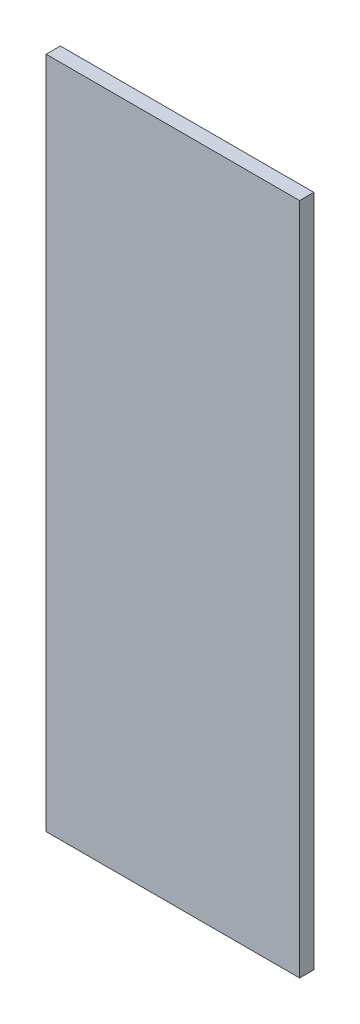
ISO-10303-21;
HEADER;
FILE_DESCRIPTION(('STEP AP214'),'2;1');
FILE_NAME('part.step','',(''),(''),'','','');
FILE_SCHEMA(('AUTOMOTIVE_DESIGN { 1 0 10303 214 1 1 1 1 }'));
ENDSEC;
DATA;
#1=APPLICATION_CONTEXT('core data for automotive mechanical design processes');
#2=APPLICATION_PROTOCOL_DEFINITION('international standard','automotive_design',2000,#1);
#3=PRODUCT_CONTEXT('',#1,'mechanical');
#4=PRODUCT('Part','Part','',(#3));
#5=PRODUCT_RELATED_PRODUCT_CATEGORY('part','',(#4));
#6=PRODUCT_DEFINITION_FORMATION('','',#4);
#7=PRODUCT_DEFINITION_CONTEXT('part definition',#1,'design');
#8=PRODUCT_DEFINITION('design','',#6,#7);
#9=PRODUCT_DEFINITION_SHAPE('','',#8);
#10=(LENGTH_UNIT() NAMED_UNIT(*) SI_UNIT(.MILLI.,.METRE.));
#11=(NAMED_UNIT(*) PLANE_ANGLE_UNIT() SI_UNIT($,.RADIAN.));
#12=(NAMED_UNIT(*) SI_UNIT($,.STERADIAN.) SOLID_ANGLE_UNIT());
#13=UNCERTAINTY_MEASURE_WITH_UNIT(LENGTH_MEASURE(1.E-05),#10,'distance_accuracy_value','');
#14=(GEOMETRIC_REPRESENTATION_CONTEXT(3) GLOBAL_UNCERTAINTY_ASSIGNED_CONTEXT((#13)) GLOBAL_UNIT_ASSIGNED_CONTEXT((#10,
#11,#12)) REPRESENTATION_CONTEXT('',''));
#15=CARTESIAN_POINT('',(0.,0.,0.));
#16=DIRECTION('',(0.,0.,1.));
#17=DIRECTION('',(1.,0.,0.));
#18=AXIS2_PLACEMENT_3D('',#15,#16,#17);
#19=CARTESIAN_POINT('',(28.275,-75.1,3.175));
#20=DIRECTION('',(-1.,0.,0.));
#21=DIRECTION('',(0.,0.,1.));
#22=AXIS2_PLACEMENT_3D('',#19,#20,#21);
#23=PLANE('',#22);
#24=DIRECTION('',(0.,1.,0.));
#25=VECTOR('',#24,1.);
#26=CARTESIAN_POINT('',(28.275,-75.1,0.));
#27=LINE('',#26,#25);
#28=CARTESIAN_POINT('',(28.275,-75.1,0.));
#29=VERTEX_POINT('',#28);
#30=CARTESIAN_POINT('',(28.275,75.1,0.));
#31=VERTEX_POINT('',#30);
#32=EDGE_CURVE('E111',#29,#31,#27,.T.);
#33=ORIENTED_EDGE('',*,*,#32,.T.);
#34=DIRECTION('',(0.,0.,-1.));
#35=VECTOR('',#34,1.);
#36=CARTESIAN_POINT('',(28.275,75.1,3.175));
#37=LINE('',#36,#35);
#38=CARTESIAN_POINT('',(28.275,75.1,3.175));
#39=VERTEX_POINT('',#38);
#40=EDGE_CURVE('E11',#39,#31,#37,.T.);
#41=ORIENTED_EDGE('',*,*,#40,.F.);
#42=DIRECTION('',(0.,1.,0.));
#43=VECTOR('',#42,1.);
#44=CARTESIAN_POINT('',(28.275,-75.1,3.175));
#45=LINE('',#44,#43);
#46=CARTESIAN_POINT('',(28.275,-75.1,3.175));
#47=VERTEX_POINT('',#46);
#48=EDGE_CURVE('E95',#47,#39,#45,.T.);
#49=ORIENTED_EDGE('',*,*,#48,.F.);
#50=DIRECTION('',(0.,0.,-1.));
#51=VECTOR('',#50,1.);
#52=CARTESIAN_POINT('',(28.275,-75.1,3.175));
#53=LINE('',#52,#51);
#54=EDGE_CURVE('E107',#47,#29,#53,.T.);
#55=ORIENTED_EDGE('',*,*,#54,.T.);
#56=EDGE_LOOP('',(#33,#41,#49,#55));
#57=FACE_BOUND('',#56,.T.);
#58=ADVANCED_FACE('F43',(#57),#23,.F.);
#59=CARTESIAN_POINT('',(-28.275,75.1,3.175));
#60=DIRECTION('',(0.,-1.,0.));
#61=DIRECTION('',(0.,0.,-1.));
#62=AXIS2_PLACEMENT_3D('',#59,#60,#61);
#63=PLANE('',#62);
#64=DIRECTION('',(-1.,0.,0.));
#65=VECTOR('',#64,1.);
#66=CARTESIAN_POINT('',(-28.275,75.1,0.));
#67=LINE('',#66,#65);
#68=CARTESIAN_POINT('',(-28.275,75.1,0.));
#69=VERTEX_POINT('',#68);
#70=EDGE_CURVE('E100',#31,#69,#67,.T.);
#71=ORIENTED_EDGE('',*,*,#70,.T.);
#72=DIRECTION('',(0.,0.,-1.));
#73=VECTOR('',#72,1.);
#74=CARTESIAN_POINT('',(-28.275,75.1,3.175));
#75=LINE('',#74,#73);
#76=CARTESIAN_POINT('',(-28.275,75.1,3.175));
#77=VERTEX_POINT('',#76);
#78=EDGE_CURVE('E52',#77,#69,#75,.T.);
#79=ORIENTED_EDGE('',*,*,#78,.F.);
#80=DIRECTION('',(-1.,0.,0.));
#81=VECTOR('',#80,1.);
#82=CARTESIAN_POINT('',(-28.275,75.1,3.175));
#83=LINE('',#82,#81);
#84=EDGE_CURVE('E90',#39,#77,#83,.T.);
#85=ORIENTED_EDGE('',*,*,#84,.F.);
#86=ORIENTED_EDGE('',*,*,#40,.T.);
#87=EDGE_LOOP('',(#71,#79,#85,#86));
#88=FACE_BOUND('',#87,.T.);
#89=ADVANCED_FACE('F99',(#88),#63,.F.);
#90=CARTESIAN_POINT('',(-28.275,-75.1,3.175));
#91=DIRECTION('',(1.,0.,0.));
#92=DIRECTION('',(0.,0.,-1.));
#93=AXIS2_PLACEMENT_3D('',#90,#91,#92);
#94=PLANE('',#93);
#95=DIRECTION('',(0.,-1.,0.));
#96=VECTOR('',#95,1.);
#97=CARTESIAN_POINT('',(-28.275,-75.1,0.));
#98=LINE('',#97,#96);
#99=CARTESIAN_POINT('',(-28.275,-75.1,0.));
#100=VERTEX_POINT('',#99);
#101=EDGE_CURVE('E77',#69,#100,#98,.T.);
#102=ORIENTED_EDGE('',*,*,#101,.T.);
#103=DIRECTION('',(0.,0.,-1.));
#104=VECTOR('',#103,1.);
#105=CARTESIAN_POINT('',(-28.275,-75.1,3.175));
#106=LINE('',#105,#104);
#107=CARTESIAN_POINT('',(-28.275,-75.1,3.175));
#108=VERTEX_POINT('',#107);
#109=EDGE_CURVE('E102',#108,#100,#106,.T.);
#110=ORIENTED_EDGE('',*,*,#109,.F.);
#111=DIRECTION('',(0.,-1.,0.));
#112=VECTOR('',#111,1.);
#113=CARTESIAN_POINT('',(-28.275,-75.1,3.175));
#114=LINE('',#113,#112);
#115=EDGE_CURVE('E93',#77,#108,#114,.T.);
#116=ORIENTED_EDGE('',*,*,#115,.F.);
#117=ORIENTED_EDGE('',*,*,#78,.T.);
#118=EDGE_LOOP('',(#102,#110,#116,#117));
#119=FACE_BOUND('',#118,.T.);
#120=ADVANCED_FACE('F103',(#119),#94,.F.);
#121=CARTESIAN_POINT('',(-28.275,-75.1,3.175));
#122=DIRECTION('',(0.,1.,0.));
#123=DIRECTION('',(0.,0.,1.));
#124=AXIS2_PLACEMENT_3D('',#121,#122,#123);
#125=PLANE('',#124);
#126=DIRECTION('',(1.,0.,0.));
#127=VECTOR('',#126,1.);
#128=CARTESIAN_POINT('',(-28.275,-75.1,0.));
#129=LINE('',#128,#127);
#130=EDGE_CURVE('E83',#100,#29,#129,.T.);
#131=ORIENTED_EDGE('',*,*,#130,.T.);
#132=ORIENTED_EDGE('',*,*,#54,.F.);
#133=DIRECTION('',(1.,0.,0.));
#134=VECTOR('',#133,1.);
#135=CARTESIAN_POINT('',(-28.275,-75.1,3.175));
#136=LINE('',#135,#134);
#137=EDGE_CURVE('E60',#108,#47,#136,.T.);
#138=ORIENTED_EDGE('',*,*,#137,.F.);
#139=ORIENTED_EDGE('',*,*,#109,.T.);
#140=EDGE_LOOP('',(#131,#132,#138,#139));
#141=FACE_BOUND('',#140,.T.);
#142=ADVANCED_FACE('F124',(#141),#125,.F.);
#143=CARTESIAN_POINT('',(0.,0.,3.175));
#144=DIRECTION('',(0.,0.,-1.));
#145=DIRECTION('',(-1.,0.,0.));
#146=AXIS2_PLACEMENT_3D('',#143,#144,#145);
#147=PLANE('',#146);
#148=ORIENTED_EDGE('',*,*,#48,.T.);
#149=ORIENTED_EDGE('',*,*,#84,.T.);
#150=ORIENTED_EDGE('',*,*,#115,.T.);
#151=ORIENTED_EDGE('',*,*,#137,.T.);
#152=EDGE_LOOP('',(#148,#149,#150,#151));
#153=FACE_BOUND('',#152,.T.);
#154=ADVANCED_FACE('F91',(#153),#147,.F.);
#155=CARTESIAN_POINT('',(0.,0.,0.));
#156=DIRECTION('',(0.,0.,-1.));
#157=DIRECTION('',(-1.,0.,0.));
#158=AXIS2_PLACEMENT_3D('',#155,#156,#157);
#159=PLANE('',#158);
#160=ORIENTED_EDGE('',*,*,#32,.F.);
#161=ORIENTED_EDGE('',*,*,#130,.F.);
#162=ORIENTED_EDGE('',*,*,#101,.F.);
#163=ORIENTED_EDGE('',*,*,#70,.F.);
#164=EDGE_LOOP('',(#160,#161,#162,#163));
#165=FACE_BOUND('',#164,.T.);
#166=ADVANCED_FACE('F127',(#165),#159,.T.);
#167=CLOSED_SHELL('',(#58,#89,#120,#142,#154,#166));
#168=MANIFOLD_SOLID_BREP('B2',#167);
#169=ADVANCED_BREP_SHAPE_REPRESENTATION('',(#18,#168),#14);
#170=SHAPE_DEFINITION_REPRESENTATION(#9,#169);
ENDSEC;
END-ISO-10303-21;
